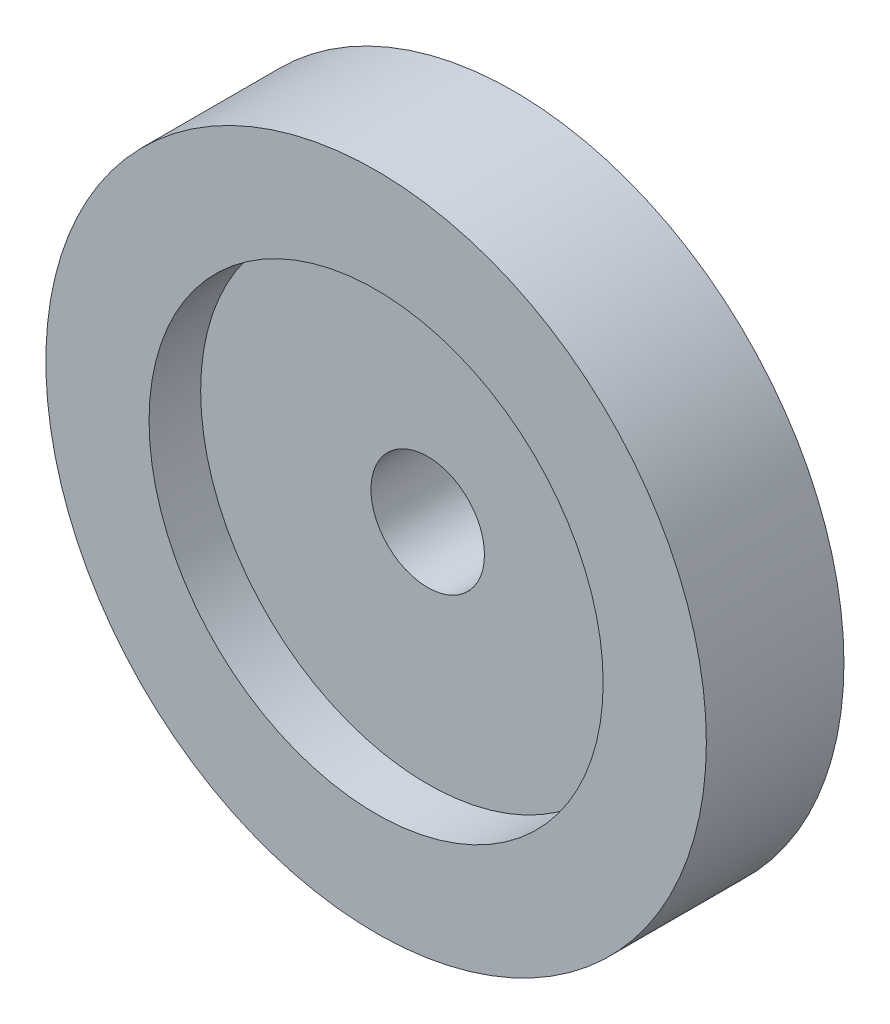
ISO-10303-21;
HEADER;
FILE_DESCRIPTION(('STEP AP214'),'2;1');
FILE_NAME('part.step','',(''),(''),'','','');
FILE_SCHEMA(('AUTOMOTIVE_DESIGN { 1 0 10303 214 1 1 1 1 }'));
ENDSEC;
DATA;
#1=APPLICATION_CONTEXT('core data for automotive mechanical design processes');
#2=APPLICATION_PROTOCOL_DEFINITION('international standard','automotive_design',2000,#1);
#3=PRODUCT_CONTEXT('',#1,'mechanical');
#4=PRODUCT('Part','Part','',(#3));
#5=PRODUCT_RELATED_PRODUCT_CATEGORY('part','',(#4));
#6=PRODUCT_DEFINITION_FORMATION('','',#4);
#7=PRODUCT_DEFINITION_CONTEXT('part definition',#1,'design');
#8=PRODUCT_DEFINITION('design','',#6,#7);
#9=PRODUCT_DEFINITION_SHAPE('','',#8);
#10=(LENGTH_UNIT() NAMED_UNIT(*) SI_UNIT(.MILLI.,.METRE.));
#11=(NAMED_UNIT(*) PLANE_ANGLE_UNIT() SI_UNIT($,.RADIAN.));
#12=(NAMED_UNIT(*) SI_UNIT($,.STERADIAN.) SOLID_ANGLE_UNIT());
#13=UNCERTAINTY_MEASURE_WITH_UNIT(LENGTH_MEASURE(1.E-05),#10,'distance_accuracy_value','');
#14=(GEOMETRIC_REPRESENTATION_CONTEXT(3) GLOBAL_UNCERTAINTY_ASSIGNED_CONTEXT((#13)) GLOBAL_UNIT_ASSIGNED_CONTEXT((#10,
#11,#12)) REPRESENTATION_CONTEXT('',''));
#15=CARTESIAN_POINT('',(0.,0.,0.));
#16=DIRECTION('',(0.,0.,1.));
#17=DIRECTION('',(1.,0.,0.));
#18=AXIS2_PLACEMENT_3D('',#15,#16,#17);
#19=CARTESIAN_POINT('',(0.,0.,0.));
#20=DIRECTION('',(0.,0.,1.));
#21=DIRECTION('',(1.,0.,0.));
#22=AXIS2_PLACEMENT_3D('',#19,#20,#21);
#23=CYLINDRICAL_SURFACE('',#22,6.6);
#24=CARTESIAN_POINT('',(0.,0.,0.));
#25=DIRECTION('',(0.,0.,1.));
#26=DIRECTION('',(1.,0.,0.));
#27=AXIS2_PLACEMENT_3D('',#24,#25,#26);
#28=CIRCLE('',#27,6.6);
#29=CARTESIAN_POINT('',(6.6,0.,0.));
#30=VERTEX_POINT('',#29);
#31=EDGE_CURVE('E34',#30,#30,#28,.F.);
#32=ORIENTED_EDGE('',*,*,#31,.F.);
#33=EDGE_LOOP('',(#32));
#34=FACE_BOUND('',#33,.T.);
#35=CARTESIAN_POINT('',(0.,0.,-1.5));
#36=DIRECTION('',(0.,0.,1.));
#37=DIRECTION('',(1.,0.,0.));
#38=AXIS2_PLACEMENT_3D('',#35,#36,#37);
#39=CIRCLE('',#38,6.6);
#40=CARTESIAN_POINT('',(6.6,0.,-1.5));
#41=VERTEX_POINT('',#40);
#42=EDGE_CURVE('E18',#41,#41,#39,.T.);
#43=ORIENTED_EDGE('',*,*,#42,.F.);
#44=EDGE_LOOP('',(#43));
#45=FACE_BOUND('',#44,.T.);
#46=ADVANCED_FACE('F15',(#34,#45),#23,.F.);
#47=CARTESIAN_POINT('',(1.65,0.,-1.5));
#48=DIRECTION('',(0.,0.,1.));
#49=DIRECTION('',(1.,0.,0.));
#50=AXIS2_PLACEMENT_3D('',#47,#48,#49);
#51=PLANE('',#50);
#52=CARTESIAN_POINT('',(0.,0.,-1.5));
#53=DIRECTION('',(0.,0.,1.));
#54=DIRECTION('',(1.,0.,0.));
#55=AXIS2_PLACEMENT_3D('',#52,#53,#54);
#56=CIRCLE('',#55,1.65);
#57=CARTESIAN_POINT('',(1.65,0.,-1.5));
#58=VERTEX_POINT('',#57);
#59=EDGE_CURVE('E32',#58,#58,#56,.F.);
#60=ORIENTED_EDGE('',*,*,#59,.T.);
#61=EDGE_LOOP('',(#60));
#62=FACE_BOUND('',#61,.T.);
#63=ORIENTED_EDGE('',*,*,#42,.T.);
#64=EDGE_LOOP('',(#63));
#65=FACE_BOUND('',#64,.T.);
#66=ADVANCED_FACE('F41',(#62,#65),#51,.T.);
#67=CARTESIAN_POINT('',(6.6,0.,0.));
#68=DIRECTION('',(0.,0.,1.));
#69=DIRECTION('',(1.,0.,0.));
#70=AXIS2_PLACEMENT_3D('',#67,#68,#69);
#71=PLANE('',#70);
#72=ORIENTED_EDGE('',*,*,#31,.T.);
#73=EDGE_LOOP('',(#72));
#74=FACE_BOUND('',#73,.T.);
#75=CARTESIAN_POINT('',(0.,0.,0.));
#76=DIRECTION('',(0.,0.,1.));
#77=DIRECTION('',(1.,0.,0.));
#78=AXIS2_PLACEMENT_3D('',#75,#76,#77);
#79=CIRCLE('',#78,9.6);
#80=CARTESIAN_POINT('',(9.6,0.,0.));
#81=VERTEX_POINT('',#80);
#82=EDGE_CURVE('E27',#81,#81,#79,.F.);
#83=ORIENTED_EDGE('',*,*,#82,.F.);
#84=EDGE_LOOP('',(#83));
#85=FACE_BOUND('',#84,.T.);
#86=ADVANCED_FACE('F49',(#74,#85),#71,.T.);
#87=CARTESIAN_POINT('',(0.,0.,0.));
#88=DIRECTION('',(0.,0.,1.));
#89=DIRECTION('',(1.,0.,0.));
#90=AXIS2_PLACEMENT_3D('',#87,#88,#89);
#91=CYLINDRICAL_SURFACE('',#90,1.65);
#92=ORIENTED_EDGE('',*,*,#59,.F.);
#93=EDGE_LOOP('',(#92));
#94=FACE_BOUND('',#93,.T.);
#95=CARTESIAN_POINT('',(0.,0.,-4.));
#96=DIRECTION('',(0.,0.,1.));
#97=DIRECTION('',(1.,0.,0.));
#98=AXIS2_PLACEMENT_3D('',#95,#96,#97);
#99=CIRCLE('',#98,1.65);
#100=CARTESIAN_POINT('',(1.65,0.,-4.));
#101=VERTEX_POINT('',#100);
#102=EDGE_CURVE('E22',#101,#101,#99,.T.);
#103=ORIENTED_EDGE('',*,*,#102,.F.);
#104=EDGE_LOOP('',(#103));
#105=FACE_BOUND('',#104,.T.);
#106=ADVANCED_FACE('F58',(#94,#105),#91,.F.);
#107=CARTESIAN_POINT('',(0.,0.,0.));
#108=DIRECTION('',(0.,0.,1.));
#109=DIRECTION('',(1.,0.,0.));
#110=AXIS2_PLACEMENT_3D('',#107,#108,#109);
#111=CYLINDRICAL_SURFACE('',#110,9.6);
#112=CARTESIAN_POINT('',(0.,0.,-4.));
#113=DIRECTION('',(0.,0.,1.));
#114=DIRECTION('',(1.,0.,0.));
#115=AXIS2_PLACEMENT_3D('',#112,#113,#114);
#116=CIRCLE('',#115,9.6);
#117=CARTESIAN_POINT('',(9.6,0.,-4.));
#118=VERTEX_POINT('',#117);
#119=EDGE_CURVE('E10',#118,#118,#116,.F.);
#120=ORIENTED_EDGE('',*,*,#119,.F.);
#121=EDGE_LOOP('',(#120));
#122=FACE_BOUND('',#121,.T.);
#123=ORIENTED_EDGE('',*,*,#82,.T.);
#124=EDGE_LOOP('',(#123));
#125=FACE_BOUND('',#124,.T.);
#126=ADVANCED_FACE('F53',(#122,#125),#111,.T.);
#127=CARTESIAN_POINT('',(9.6,0.,-4.));
#128=DIRECTION('',(0.,0.,-1.));
#129=DIRECTION('',(-1.,0.,0.));
#130=AXIS2_PLACEMENT_3D('',#127,#128,#129);
#131=PLANE('',#130);
#132=ORIENTED_EDGE('',*,*,#119,.T.);
#133=EDGE_LOOP('',(#132));
#134=FACE_BOUND('',#133,.T.);
#135=ORIENTED_EDGE('',*,*,#102,.T.);
#136=EDGE_LOOP('',(#135));
#137=FACE_BOUND('',#136,.T.);
#138=ADVANCED_FACE('F51',(#134,#137),#131,.T.);
#139=CLOSED_SHELL('',(#46,#66,#86,#106,#126,#138));
#140=MANIFOLD_SOLID_BREP('B1',#139);
#141=ADVANCED_BREP_SHAPE_REPRESENTATION('',(#18,#140),#14);
#142=SHAPE_DEFINITION_REPRESENTATION(#9,#141);
ENDSEC;
END-ISO-10303-21;
